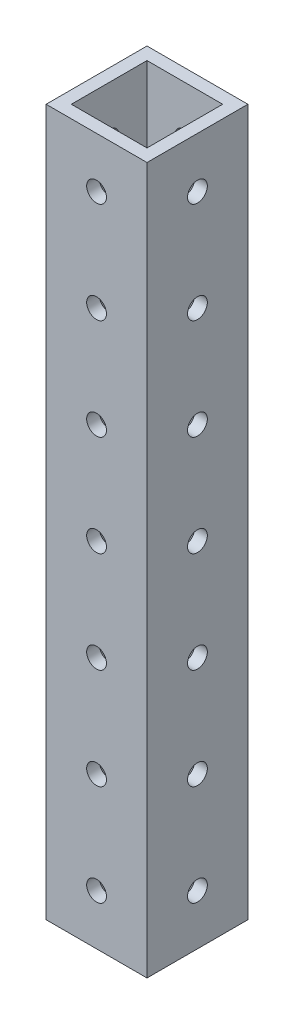
ISO-10303-21;
HEADER;
FILE_DESCRIPTION(('STEP AP214'),'2;1');
FILE_NAME('part.step','',(''),(''),'','','');
FILE_SCHEMA(('AUTOMOTIVE_DESIGN { 1 0 10303 214 1 1 1 1 }'));
ENDSEC;
DATA;
#1=APPLICATION_CONTEXT('core data for automotive mechanical design processes');
#2=APPLICATION_PROTOCOL_DEFINITION('international standard','automotive_design',2000,#1);
#3=PRODUCT_CONTEXT('',#1,'mechanical');
#4=PRODUCT('Part','Part','',(#3));
#5=PRODUCT_RELATED_PRODUCT_CATEGORY('part','',(#4));
#6=PRODUCT_DEFINITION_FORMATION('','',#4);
#7=PRODUCT_DEFINITION_CONTEXT('part definition',#1,'design');
#8=PRODUCT_DEFINITION('design','',#6,#7);
#9=PRODUCT_DEFINITION_SHAPE('','',#8);
#10=(LENGTH_UNIT() NAMED_UNIT(*) SI_UNIT(.MILLI.,.METRE.));
#11=(NAMED_UNIT(*) PLANE_ANGLE_UNIT() SI_UNIT($,.RADIAN.));
#12=(NAMED_UNIT(*) SI_UNIT($,.STERADIAN.) SOLID_ANGLE_UNIT());
#13=UNCERTAINTY_MEASURE_WITH_UNIT(LENGTH_MEASURE(1.E-05),#10,'distance_accuracy_value','');
#14=(GEOMETRIC_REPRESENTATION_CONTEXT(3) GLOBAL_UNCERTAINTY_ASSIGNED_CONTEXT((#13)) GLOBAL_UNIT_ASSIGNED_CONTEXT((#10,
#11,#12)) REPRESENTATION_CONTEXT('',''));
#15=CARTESIAN_POINT('',(0.,0.,0.));
#16=DIRECTION('',(0.,0.,1.));
#17=DIRECTION('',(1.,0.,0.));
#18=AXIS2_PLACEMENT_3D('',#15,#16,#17);
#19=CARTESIAN_POINT('',(6.35000000000008,678.023468227804,-25.4));
#20=DIRECTION('',(0.,1.,0.));
#21=DIRECTION('',(0.,0.,1.));
#22=AXIS2_PLACEMENT_3D('',#19,#20,#21);
#23=PLANE('',#22);
#24=DIRECTION('',(-1.,0.,0.));
#25=VECTOR('',#24,1.);
#26=CARTESIAN_POINT('',(6.35000000000008,678.023468227804,0.));
#27=LINE('',#26,#25);
#28=CARTESIAN_POINT('',(31.7500000000001,678.023468227804,0.));
#29=VERTEX_POINT('',#28);
#30=CARTESIAN_POINT('',(6.35000000000008,678.023468227804,0.));
#31=VERTEX_POINT('',#30);
#32=EDGE_CURVE('E145',#29,#31,#27,.T.);
#33=ORIENTED_EDGE('',*,*,#32,.F.);
#34=DIRECTION('',(0.,0.,1.));
#35=VECTOR('',#34,1.);
#36=CARTESIAN_POINT('',(31.7500000000001,678.023468227804,-25.4));
#37=LINE('',#36,#35);
#38=CARTESIAN_POINT('',(31.7500000000001,678.023468227804,-25.4));
#39=VERTEX_POINT('',#38);
#40=EDGE_CURVE('E48',#39,#29,#37,.T.);
#41=ORIENTED_EDGE('',*,*,#40,.F.);
#42=DIRECTION('',(-1.,0.,0.));
#43=VECTOR('',#42,1.);
#44=CARTESIAN_POINT('',(6.35000000000008,678.023468227804,-25.4));
#45=LINE('',#44,#43);
#46=CARTESIAN_POINT('',(6.35000000000008,678.023468227804,-25.4));
#47=VERTEX_POINT('',#46);
#48=EDGE_CURVE('E151',#39,#47,#45,.T.);
#49=ORIENTED_EDGE('',*,*,#48,.T.);
#50=DIRECTION('',(0.,0.,1.));
#51=VECTOR('',#50,1.);
#52=CARTESIAN_POINT('',(6.35000000000008,678.023468227804,-25.4));
#53=LINE('',#52,#51);
#54=EDGE_CURVE('E11',#47,#31,#53,.T.);
#55=ORIENTED_EDGE('',*,*,#54,.T.);
#56=EDGE_LOOP('',(#33,#41,#49,#55));
#57=FACE_BOUND('',#56,.T.);
#58=DIRECTION('',(0.,0.,1.));
#59=VECTOR('',#58,1.);
#60=CARTESIAN_POINT('',(28.5750000000001,678.023468227804,-25.4));
#61=LINE('',#60,#59);
#62=CARTESIAN_POINT('',(28.5750000000001,678.023468227804,-22.225));
#63=VERTEX_POINT('',#62);
#64=CARTESIAN_POINT('',(28.5750000000001,678.023468227804,-3.175));
#65=VERTEX_POINT('',#64);
#66=EDGE_CURVE('E115',#63,#65,#61,.T.);
#67=ORIENTED_EDGE('',*,*,#66,.T.);
#68=DIRECTION('',(-1.,0.,0.));
#69=VECTOR('',#68,1.);
#70=CARTESIAN_POINT('',(0.,678.023468227804,-3.175));
#71=LINE('',#70,#69);
#72=CARTESIAN_POINT('',(9.52500000000007,678.023468227804,-3.175));
#73=VERTEX_POINT('',#72);
#74=EDGE_CURVE('E121',#65,#73,#71,.T.);
#75=ORIENTED_EDGE('',*,*,#74,.T.);
#76=DIRECTION('',(0.,0.,1.));
#77=VECTOR('',#76,1.);
#78=CARTESIAN_POINT('',(9.52500000000007,678.023468227804,-25.4));
#79=LINE('',#78,#77);
#80=CARTESIAN_POINT('',(9.52500000000007,678.023468227804,-22.225));
#81=VERTEX_POINT('',#80);
#82=EDGE_CURVE('E106',#81,#73,#79,.T.);
#83=ORIENTED_EDGE('',*,*,#82,.F.);
#84=DIRECTION('',(-1.,0.,0.));
#85=VECTOR('',#84,1.);
#86=CARTESIAN_POINT('',(0.,678.023468227804,-22.225));
#87=LINE('',#86,#85);
#88=EDGE_CURVE('E56',#63,#81,#87,.T.);
#89=ORIENTED_EDGE('',*,*,#88,.F.);
#90=EDGE_LOOP('',(#67,#75,#83,#89));
#91=FACE_BOUND('',#90,.T.);
#92=ADVANCED_FACE('F39',(#57,#91),#23,.T.);
#93=CARTESIAN_POINT('',(6.3500000000001,500.223468227803,-25.4));
#94=DIRECTION('',(0.,-1.,0.));
#95=DIRECTION('',(0.,0.,-1.));
#96=AXIS2_PLACEMENT_3D('',#93,#94,#95);
#97=PLANE('',#96);
#98=DIRECTION('',(1.,0.,0.));
#99=VECTOR('',#98,1.);
#100=CARTESIAN_POINT('',(6.3500000000001,500.223468227803,0.));
#101=LINE('',#100,#99);
#102=CARTESIAN_POINT('',(6.3500000000001,500.223468227803,0.));
#103=VERTEX_POINT('',#102);
#104=CARTESIAN_POINT('',(31.7500000000001,500.223468227803,0.));
#105=VERTEX_POINT('',#104);
#106=EDGE_CURVE('E157',#103,#105,#101,.T.);
#107=ORIENTED_EDGE('',*,*,#106,.F.);
#108=DIRECTION('',(0.,0.,1.));
#109=VECTOR('',#108,1.);
#110=CARTESIAN_POINT('',(6.3500000000001,500.223468227803,-25.4));
#111=LINE('',#110,#109);
#112=CARTESIAN_POINT('',(6.3500000000001,500.223468227803,-25.4));
#113=VERTEX_POINT('',#112);
#114=EDGE_CURVE('E154',#113,#103,#111,.T.);
#115=ORIENTED_EDGE('',*,*,#114,.F.);
#116=DIRECTION('',(1.,0.,0.));
#117=VECTOR('',#116,1.);
#118=CARTESIAN_POINT('',(6.3500000000001,500.223468227803,-25.4));
#119=LINE('',#118,#117);
#120=CARTESIAN_POINT('',(31.7500000000001,500.223468227803,-25.4));
#121=VERTEX_POINT('',#120);
#122=EDGE_CURVE('E144',#113,#121,#119,.T.);
#123=ORIENTED_EDGE('',*,*,#122,.T.);
#124=DIRECTION('',(0.,0.,1.));
#125=VECTOR('',#124,1.);
#126=CARTESIAN_POINT('',(31.7500000000001,500.223468227803,-25.4));
#127=LINE('',#126,#125);
#128=EDGE_CURVE('E166',#121,#105,#127,.T.);
#129=ORIENTED_EDGE('',*,*,#128,.T.);
#130=EDGE_LOOP('',(#107,#115,#123,#129));
#131=FACE_BOUND('',#130,.T.);
#132=DIRECTION('',(0.,0.,1.));
#133=VECTOR('',#132,1.);
#134=CARTESIAN_POINT('',(9.5250000000001,500.223468227803,-25.4));
#135=LINE('',#134,#133);
#136=CARTESIAN_POINT('',(9.5250000000001,500.223468227803,-22.225));
#137=VERTEX_POINT('',#136);
#138=CARTESIAN_POINT('',(9.5250000000001,500.223468227803,-3.175));
#139=VERTEX_POINT('',#138);
#140=EDGE_CURVE('E135',#137,#139,#135,.T.);
#141=ORIENTED_EDGE('',*,*,#140,.T.);
#142=DIRECTION('',(1.,0.,0.));
#143=VECTOR('',#142,1.);
#144=CARTESIAN_POINT('',(0.,500.223468227803,-3.175));
#145=LINE('',#144,#143);
#146=CARTESIAN_POINT('',(28.5750000000001,500.223468227803,-3.175));
#147=VERTEX_POINT('',#146);
#148=EDGE_CURVE('E124',#139,#147,#145,.T.);
#149=ORIENTED_EDGE('',*,*,#148,.T.);
#150=DIRECTION('',(0.,0.,1.));
#151=VECTOR('',#150,1.);
#152=CARTESIAN_POINT('',(28.5750000000001,500.223468227803,-25.4));
#153=LINE('',#152,#151);
#154=CARTESIAN_POINT('',(28.5750000000001,500.223468227803,-22.225));
#155=VERTEX_POINT('',#154);
#156=EDGE_CURVE('E133',#155,#147,#153,.T.);
#157=ORIENTED_EDGE('',*,*,#156,.F.);
#158=DIRECTION('',(1.,0.,0.));
#159=VECTOR('',#158,1.);
#160=CARTESIAN_POINT('',(0.,500.223468227803,-22.225));
#161=LINE('',#160,#159);
#162=EDGE_CURVE('E61',#137,#155,#161,.T.);
#163=ORIENTED_EDGE('',*,*,#162,.F.);
#164=EDGE_LOOP('',(#141,#149,#157,#163));
#165=FACE_BOUND('',#164,.T.);
#166=ADVANCED_FACE('F294',(#131,#165),#97,.T.);
#167=CARTESIAN_POINT('',(6.35000000000008,678.023468227804,-25.4));
#168=DIRECTION('',(-1.,0.,0.));
#169=DIRECTION('',(0.,-1.,0.));
#170=AXIS2_PLACEMENT_3D('',#167,#168,#169);
#171=PLANE('',#170);
#172=CARTESIAN_POINT('',(6.3500000000001,512.923468227797,-12.6999999999756));
#173=DIRECTION('',(-1.,0.,0.));
#174=DIRECTION('',(0.,-1.,0.));
#175=AXIS2_PLACEMENT_3D('',#172,#173,#174);
#176=CIRCLE('',#175,2.48919999999991);
#177=CARTESIAN_POINT('',(6.3500000000001,510.434268227797,-12.6999999999756));
#178=VERTEX_POINT('',#177);
#179=EDGE_CURVE('E484',#178,#178,#176,.T.);
#180=ORIENTED_EDGE('',*,*,#179,.F.);
#181=EDGE_LOOP('',(#180));
#182=FACE_BOUND('',#181,.T.);
#183=CARTESIAN_POINT('',(6.35000000000009,538.323468227797,-12.6999999999756));
#184=DIRECTION('',(-1.,0.,0.));
#185=DIRECTION('',(0.,-1.,0.));
#186=AXIS2_PLACEMENT_3D('',#183,#184,#185);
#187=CIRCLE('',#186,2.48919999999991);
#188=CARTESIAN_POINT('',(6.35000000000009,535.834268227797,-12.6999999999756));
#189=VERTEX_POINT('',#188);
#190=EDGE_CURVE('E481',#189,#189,#187,.T.);
#191=ORIENTED_EDGE('',*,*,#190,.F.);
#192=EDGE_LOOP('',(#191));
#193=FACE_BOUND('',#192,.T.);
#194=CARTESIAN_POINT('',(6.35000000000009,563.723468227797,-12.6999999999756));
#195=DIRECTION('',(-1.,0.,0.));
#196=DIRECTION('',(0.,-1.,0.));
#197=AXIS2_PLACEMENT_3D('',#194,#195,#196);
#198=CIRCLE('',#197,2.48919999999991);
#199=CARTESIAN_POINT('',(6.35000000000009,561.234268227797,-12.6999999999756));
#200=VERTEX_POINT('',#199);
#201=EDGE_CURVE('E475',#200,#200,#198,.T.);
#202=ORIENTED_EDGE('',*,*,#201,.F.);
#203=EDGE_LOOP('',(#202));
#204=FACE_BOUND('',#203,.T.);
#205=CARTESIAN_POINT('',(6.35000000000009,589.123468227797,-12.6999999999756));
#206=DIRECTION('',(-1.,0.,0.));
#207=DIRECTION('',(0.,-1.,0.));
#208=AXIS2_PLACEMENT_3D('',#205,#206,#207);
#209=CIRCLE('',#208,2.48919999999988);
#210=CARTESIAN_POINT('',(6.35000000000009,586.634268227797,-12.6999999999756));
#211=VERTEX_POINT('',#210);
#212=EDGE_CURVE('E469',#211,#211,#209,.T.);
#213=ORIENTED_EDGE('',*,*,#212,.F.);
#214=EDGE_LOOP('',(#213));
#215=FACE_BOUND('',#214,.T.);
#216=CARTESIAN_POINT('',(6.35000000000008,614.523468227797,-12.6999999999756));
#217=DIRECTION('',(-1.,0.,0.));
#218=DIRECTION('',(0.,-1.,0.));
#219=AXIS2_PLACEMENT_3D('',#216,#217,#218);
#220=CIRCLE('',#219,2.48919999999991);
#221=CARTESIAN_POINT('',(6.35000000000008,612.034268227797,-12.6999999999756));
#222=VERTEX_POINT('',#221);
#223=EDGE_CURVE('E463',#222,#222,#220,.T.);
#224=ORIENTED_EDGE('',*,*,#223,.F.);
#225=EDGE_LOOP('',(#224));
#226=FACE_BOUND('',#225,.T.);
#227=CARTESIAN_POINT('',(6.35000000000008,639.923468227797,-12.6999999999756));
#228=DIRECTION('',(-1.,0.,0.));
#229=DIRECTION('',(0.,-1.,0.));
#230=AXIS2_PLACEMENT_3D('',#227,#228,#229);
#231=CIRCLE('',#230,2.48919999999991);
#232=CARTESIAN_POINT('',(6.35000000000008,637.434268227797,-12.6999999999756));
#233=VERTEX_POINT('',#232);
#234=EDGE_CURVE('E457',#233,#233,#231,.T.);
#235=ORIENTED_EDGE('',*,*,#234,.F.);
#236=EDGE_LOOP('',(#235));
#237=FACE_BOUND('',#236,.T.);
#238=CARTESIAN_POINT('',(6.35000000000008,665.323468227797,-12.6999999999756));
#239=DIRECTION('',(-1.,0.,0.));
#240=DIRECTION('',(0.,-1.,0.));
#241=AXIS2_PLACEMENT_3D('',#238,#239,#240);
#242=CIRCLE('',#241,2.48919999999989);
#243=CARTESIAN_POINT('',(6.35000000000008,662.834268227797,-12.6999999999756));
#244=VERTEX_POINT('',#243);
#245=EDGE_CURVE('E435',#244,#244,#242,.T.);
#246=ORIENTED_EDGE('',*,*,#245,.F.);
#247=EDGE_LOOP('',(#246));
#248=FACE_BOUND('',#247,.T.);
#249=DIRECTION('',(0.,-1.,0.));
#250=VECTOR('',#249,1.);
#251=CARTESIAN_POINT('',(6.35000000000008,678.023468227804,0.));
#252=LINE('',#251,#250);
#253=EDGE_CURVE('E114',#31,#103,#252,.T.);
#254=ORIENTED_EDGE('',*,*,#253,.F.);
#255=ORIENTED_EDGE('',*,*,#54,.F.);
#256=DIRECTION('',(0.,-1.,0.));
#257=VECTOR('',#256,1.);
#258=CARTESIAN_POINT('',(6.35000000000008,678.023468227804,-25.4));
#259=LINE('',#258,#257);
#260=EDGE_CURVE('E141',#47,#113,#259,.T.);
#261=ORIENTED_EDGE('',*,*,#260,.T.);
#262=ORIENTED_EDGE('',*,*,#114,.T.);
#263=EDGE_LOOP('',(#254,#255,#261,#262));
#264=FACE_BOUND('',#263,.T.);
#265=ADVANCED_FACE('F41',(#182,#193,#204,#215,#226,#237,#248,#264),#171,.T.);
#266=CARTESIAN_POINT('',(31.7500000000001,678.023468227804,-25.4));
#267=DIRECTION('',(1.,0.,0.));
#268=DIRECTION('',(0.,1.,0.));
#269=AXIS2_PLACEMENT_3D('',#266,#267,#268);
#270=PLANE('',#269);
#271=CARTESIAN_POINT('',(31.7500000000001,512.923468227797,-12.6999999999756));
#272=DIRECTION('',(-1.,0.,0.));
#273=DIRECTION('',(0.,-1.,0.));
#274=AXIS2_PLACEMENT_3D('',#271,#272,#273);
#275=CIRCLE('',#274,2.48919999999991);
#276=CARTESIAN_POINT('',(31.7500000000001,510.434268227797,-12.6999999999756));
#277=VERTEX_POINT('',#276);
#278=EDGE_CURVE('E201',#277,#277,#275,.T.);
#279=ORIENTED_EDGE('',*,*,#278,.T.);
#280=EDGE_LOOP('',(#279));
#281=FACE_BOUND('',#280,.T.);
#282=CARTESIAN_POINT('',(31.7500000000001,538.323468227797,-12.6999999999756));
#283=DIRECTION('',(-1.,0.,0.));
#284=DIRECTION('',(0.,-1.,0.));
#285=AXIS2_PLACEMENT_3D('',#282,#283,#284);
#286=CIRCLE('',#285,2.48919999999991);
#287=CARTESIAN_POINT('',(31.7500000000001,535.834268227797,-12.6999999999756));
#288=VERTEX_POINT('',#287);
#289=EDGE_CURVE('E478',#288,#288,#286,.T.);
#290=ORIENTED_EDGE('',*,*,#289,.T.);
#291=EDGE_LOOP('',(#290));
#292=FACE_BOUND('',#291,.T.);
#293=CARTESIAN_POINT('',(31.7500000000001,563.723468227797,-12.6999999999756));
#294=DIRECTION('',(-1.,0.,0.));
#295=DIRECTION('',(0.,-1.,0.));
#296=AXIS2_PLACEMENT_3D('',#293,#294,#295);
#297=CIRCLE('',#296,2.48919999999991);
#298=CARTESIAN_POINT('',(31.7500000000001,561.234268227797,-12.6999999999756));
#299=VERTEX_POINT('',#298);
#300=EDGE_CURVE('E472',#299,#299,#297,.T.);
#301=ORIENTED_EDGE('',*,*,#300,.T.);
#302=EDGE_LOOP('',(#301));
#303=FACE_BOUND('',#302,.T.);
#304=CARTESIAN_POINT('',(31.7500000000001,589.123468227797,-12.6999999999756));
#305=DIRECTION('',(-1.,0.,0.));
#306=DIRECTION('',(0.,-1.,0.));
#307=AXIS2_PLACEMENT_3D('',#304,#305,#306);
#308=CIRCLE('',#307,2.48919999999988);
#309=CARTESIAN_POINT('',(31.7500000000001,586.634268227797,-12.6999999999756));
#310=VERTEX_POINT('',#309);
#311=EDGE_CURVE('E466',#310,#310,#308,.T.);
#312=ORIENTED_EDGE('',*,*,#311,.T.);
#313=EDGE_LOOP('',(#312));
#314=FACE_BOUND('',#313,.T.);
#315=CARTESIAN_POINT('',(31.7500000000001,614.523468227797,-12.6999999999756));
#316=DIRECTION('',(-1.,0.,0.));
#317=DIRECTION('',(0.,-1.,0.));
#318=AXIS2_PLACEMENT_3D('',#315,#316,#317);
#319=CIRCLE('',#318,2.48919999999991);
#320=CARTESIAN_POINT('',(31.7500000000001,612.034268227797,-12.6999999999756));
#321=VERTEX_POINT('',#320);
#322=EDGE_CURVE('E460',#321,#321,#319,.T.);
#323=ORIENTED_EDGE('',*,*,#322,.T.);
#324=EDGE_LOOP('',(#323));
#325=FACE_BOUND('',#324,.T.);
#326=CARTESIAN_POINT('',(31.7500000000001,639.923468227797,-12.6999999999756));
#327=DIRECTION('',(-1.,0.,0.));
#328=DIRECTION('',(0.,-1.,0.));
#329=AXIS2_PLACEMENT_3D('',#326,#327,#328);
#330=CIRCLE('',#329,2.48919999999991);
#331=CARTESIAN_POINT('',(31.7500000000001,637.434268227797,-12.6999999999756));
#332=VERTEX_POINT('',#331);
#333=EDGE_CURVE('E438',#332,#332,#330,.T.);
#334=ORIENTED_EDGE('',*,*,#333,.T.);
#335=EDGE_LOOP('',(#334));
#336=FACE_BOUND('',#335,.T.);
#337=CARTESIAN_POINT('',(31.7500000000001,665.323468227797,-12.6999999999756));
#338=DIRECTION('',(-1.,0.,0.));
#339=DIRECTION('',(0.,-1.,0.));
#340=AXIS2_PLACEMENT_3D('',#337,#338,#339);
#341=CIRCLE('',#340,2.48919999999989);
#342=CARTESIAN_POINT('',(31.7500000000001,662.834268227797,-12.6999999999756));
#343=VERTEX_POINT('',#342);
#344=EDGE_CURVE('E433',#343,#343,#341,.T.);
#345=ORIENTED_EDGE('',*,*,#344,.T.);
#346=EDGE_LOOP('',(#345));
#347=FACE_BOUND('',#346,.T.);
#348=DIRECTION('',(0.,1.,0.));
#349=VECTOR('',#348,1.);
#350=CARTESIAN_POINT('',(31.7500000000001,678.023468227804,0.));
#351=LINE('',#350,#349);
#352=EDGE_CURVE('E160',#105,#29,#351,.T.);
#353=ORIENTED_EDGE('',*,*,#352,.F.);
#354=ORIENTED_EDGE('',*,*,#128,.F.);
#355=DIRECTION('',(0.,1.,0.));
#356=VECTOR('',#355,1.);
#357=CARTESIAN_POINT('',(31.7500000000001,678.023468227804,-25.4));
#358=LINE('',#357,#356);
#359=EDGE_CURVE('E148',#121,#39,#358,.T.);
#360=ORIENTED_EDGE('',*,*,#359,.T.);
#361=ORIENTED_EDGE('',*,*,#40,.T.);
#362=EDGE_LOOP('',(#353,#354,#360,#361));
#363=FACE_BOUND('',#362,.T.);
#364=ADVANCED_FACE('F302',(#281,#292,#303,#314,#325,#336,#347,#363),#270,.T.);
#365=CARTESIAN_POINT('',(0.,0.,-25.4));
#366=DIRECTION('',(0.,0.,1.));
#367=DIRECTION('',(1.,0.,0.));
#368=AXIS2_PLACEMENT_3D('',#365,#366,#367);
#369=PLANE('',#368);
#370=CARTESIAN_POINT('',(19.0500000000001,512.923468227804,-25.4));
#371=DIRECTION('',(0.,0.,1.));
#372=DIRECTION('',(1.,0.,0.));
#373=AXIS2_PLACEMENT_3D('',#370,#371,#372);
#374=CIRCLE('',#373,2.48919999999991);
#375=CARTESIAN_POINT('',(21.5392,512.923468227804,-25.4));
#376=VERTEX_POINT('',#375);
#377=EDGE_CURVE('E173',#376,#376,#374,.T.);
#378=ORIENTED_EDGE('',*,*,#377,.T.);
#379=EDGE_LOOP('',(#378));
#380=FACE_BOUND('',#379,.T.);
#381=CARTESIAN_POINT('',(19.0500000000001,538.323468227804,-25.4));
#382=DIRECTION('',(0.,0.,1.));
#383=DIRECTION('',(1.,0.,0.));
#384=AXIS2_PLACEMENT_3D('',#381,#382,#383);
#385=CIRCLE('',#384,2.48919999999991);
#386=CARTESIAN_POINT('',(21.5392,538.323468227804,-25.4));
#387=VERTEX_POINT('',#386);
#388=EDGE_CURVE('E243',#387,#387,#385,.T.);
#389=ORIENTED_EDGE('',*,*,#388,.T.);
#390=EDGE_LOOP('',(#389));
#391=FACE_BOUND('',#390,.T.);
#392=CARTESIAN_POINT('',(19.05,563.723468227804,-25.4));
#393=DIRECTION('',(0.,0.,1.));
#394=DIRECTION('',(1.,0.,0.));
#395=AXIS2_PLACEMENT_3D('',#392,#393,#394);
#396=CIRCLE('',#395,2.48919999999991);
#397=CARTESIAN_POINT('',(21.5391999999999,563.723468227804,-25.4));
#398=VERTEX_POINT('',#397);
#399=EDGE_CURVE('E249',#398,#398,#396,.T.);
#400=ORIENTED_EDGE('',*,*,#399,.T.);
#401=EDGE_LOOP('',(#400));
#402=FACE_BOUND('',#401,.T.);
#403=CARTESIAN_POINT('',(19.05,589.123468227804,-25.4));
#404=DIRECTION('',(0.,0.,1.));
#405=DIRECTION('',(1.,0.,0.));
#406=AXIS2_PLACEMENT_3D('',#403,#404,#405);
#407=CIRCLE('',#406,2.48919999999988);
#408=CARTESIAN_POINT('',(21.5391999999999,589.123468227804,-25.4));
#409=VERTEX_POINT('',#408);
#410=EDGE_CURVE('E255',#409,#409,#407,.T.);
#411=ORIENTED_EDGE('',*,*,#410,.T.);
#412=EDGE_LOOP('',(#411));
#413=FACE_BOUND('',#412,.T.);
#414=CARTESIAN_POINT('',(19.05,614.523468227804,-25.4));
#415=DIRECTION('',(0.,0.,1.));
#416=DIRECTION('',(1.,0.,0.));
#417=AXIS2_PLACEMENT_3D('',#414,#415,#416);
#418=CIRCLE('',#417,2.48919999999991);
#419=CARTESIAN_POINT('',(21.5391999999999,614.523468227804,-25.4));
#420=VERTEX_POINT('',#419);
#421=EDGE_CURVE('E261',#420,#420,#418,.T.);
#422=ORIENTED_EDGE('',*,*,#421,.T.);
#423=EDGE_LOOP('',(#422));
#424=FACE_BOUND('',#423,.T.);
#425=CARTESIAN_POINT('',(19.0499999999999,639.923468227803,-25.4));
#426=DIRECTION('',(0.,0.,1.));
#427=DIRECTION('',(1.,0.,0.));
#428=AXIS2_PLACEMENT_3D('',#425,#426,#427);
#429=CIRCLE('',#428,2.48919999999991);
#430=CARTESIAN_POINT('',(21.5391999999999,639.923468227803,-25.4));
#431=VERTEX_POINT('',#430);
#432=EDGE_CURVE('E267',#431,#431,#429,.T.);
#433=ORIENTED_EDGE('',*,*,#432,.T.);
#434=EDGE_LOOP('',(#433));
#435=FACE_BOUND('',#434,.T.);
#436=CARTESIAN_POINT('',(19.0499999999999,665.323468227803,-25.4));
#437=DIRECTION('',(0.,0.,1.));
#438=DIRECTION('',(1.,0.,0.));
#439=AXIS2_PLACEMENT_3D('',#436,#437,#438);
#440=CIRCLE('',#439,2.48919999999993);
#441=CARTESIAN_POINT('',(21.5391999999999,665.323468227803,-25.4));
#442=VERTEX_POINT('',#441);
#443=EDGE_CURVE('E234',#442,#442,#440,.T.);
#444=ORIENTED_EDGE('',*,*,#443,.T.);
#445=EDGE_LOOP('',(#444));
#446=FACE_BOUND('',#445,.T.);
#447=ORIENTED_EDGE('',*,*,#260,.F.);
#448=ORIENTED_EDGE('',*,*,#48,.F.);
#449=ORIENTED_EDGE('',*,*,#359,.F.);
#450=ORIENTED_EDGE('',*,*,#122,.F.);
#451=EDGE_LOOP('',(#447,#448,#449,#450));
#452=FACE_BOUND('',#451,.T.);
#453=ADVANCED_FACE('F309',(#380,#391,#402,#413,#424,#435,#446,#452),#369,.F.);
#454=CARTESIAN_POINT('',(0.,0.,0.));
#455=DIRECTION('',(0.,0.,1.));
#456=DIRECTION('',(1.,0.,0.));
#457=AXIS2_PLACEMENT_3D('',#454,#455,#456);
#458=PLANE('',#457);
#459=CARTESIAN_POINT('',(19.0500000000001,512.923468227804,0.));
#460=DIRECTION('',(0.,0.,1.));
#461=DIRECTION('',(1.,0.,0.));
#462=AXIS2_PLACEMENT_3D('',#459,#460,#461);
#463=CIRCLE('',#462,2.48919999999991);
#464=CARTESIAN_POINT('',(21.5392,512.923468227804,0.));
#465=VERTEX_POINT('',#464);
#466=EDGE_CURVE('E237',#465,#465,#463,.T.);
#467=ORIENTED_EDGE('',*,*,#466,.F.);
#468=EDGE_LOOP('',(#467));
#469=FACE_BOUND('',#468,.T.);
#470=CARTESIAN_POINT('',(19.0500000000001,538.323468227804,0.));
#471=DIRECTION('',(0.,0.,1.));
#472=DIRECTION('',(1.,0.,0.));
#473=AXIS2_PLACEMENT_3D('',#470,#471,#472);
#474=CIRCLE('',#473,2.48919999999991);
#475=CARTESIAN_POINT('',(21.5392,538.323468227804,0.));
#476=VERTEX_POINT('',#475);
#477=EDGE_CURVE('E240',#476,#476,#474,.T.);
#478=ORIENTED_EDGE('',*,*,#477,.F.);
#479=EDGE_LOOP('',(#478));
#480=FACE_BOUND('',#479,.T.);
#481=CARTESIAN_POINT('',(19.05,563.723468227804,0.));
#482=DIRECTION('',(0.,0.,1.));
#483=DIRECTION('',(1.,0.,0.));
#484=AXIS2_PLACEMENT_3D('',#481,#482,#483);
#485=CIRCLE('',#484,2.48919999999991);
#486=CARTESIAN_POINT('',(21.5391999999999,563.723468227804,0.));
#487=VERTEX_POINT('',#486);
#488=EDGE_CURVE('E246',#487,#487,#485,.T.);
#489=ORIENTED_EDGE('',*,*,#488,.F.);
#490=EDGE_LOOP('',(#489));
#491=FACE_BOUND('',#490,.T.);
#492=CARTESIAN_POINT('',(19.05,589.123468227804,0.));
#493=DIRECTION('',(0.,0.,1.));
#494=DIRECTION('',(1.,0.,0.));
#495=AXIS2_PLACEMENT_3D('',#492,#493,#494);
#496=CIRCLE('',#495,2.48919999999988);
#497=CARTESIAN_POINT('',(21.5391999999999,589.123468227804,0.));
#498=VERTEX_POINT('',#497);
#499=EDGE_CURVE('E252',#498,#498,#496,.T.);
#500=ORIENTED_EDGE('',*,*,#499,.F.);
#501=EDGE_LOOP('',(#500));
#502=FACE_BOUND('',#501,.T.);
#503=CARTESIAN_POINT('',(19.05,614.523468227804,0.));
#504=DIRECTION('',(0.,0.,1.));
#505=DIRECTION('',(1.,0.,0.));
#506=AXIS2_PLACEMENT_3D('',#503,#504,#505);
#507=CIRCLE('',#506,2.48919999999991);
#508=CARTESIAN_POINT('',(21.5391999999999,614.523468227804,0.));
#509=VERTEX_POINT('',#508);
#510=EDGE_CURVE('E258',#509,#509,#507,.T.);
#511=ORIENTED_EDGE('',*,*,#510,.F.);
#512=EDGE_LOOP('',(#511));
#513=FACE_BOUND('',#512,.T.);
#514=CARTESIAN_POINT('',(19.0499999999999,639.923468227803,0.));
#515=DIRECTION('',(0.,0.,1.));
#516=DIRECTION('',(1.,0.,0.));
#517=AXIS2_PLACEMENT_3D('',#514,#515,#516);
#518=CIRCLE('',#517,2.48919999999991);
#519=CARTESIAN_POINT('',(21.5391999999999,639.923468227803,0.));
#520=VERTEX_POINT('',#519);
#521=EDGE_CURVE('E264',#520,#520,#518,.T.);
#522=ORIENTED_EDGE('',*,*,#521,.F.);
#523=EDGE_LOOP('',(#522));
#524=FACE_BOUND('',#523,.T.);
#525=CARTESIAN_POINT('',(19.0499999999999,665.323468227803,0.));
#526=DIRECTION('',(0.,0.,1.));
#527=DIRECTION('',(1.,0.,0.));
#528=AXIS2_PLACEMENT_3D('',#525,#526,#527);
#529=CIRCLE('',#528,2.48919999999993);
#530=CARTESIAN_POINT('',(21.5391999999999,665.323468227803,0.));
#531=VERTEX_POINT('',#530);
#532=EDGE_CURVE('E270',#531,#531,#529,.T.);
#533=ORIENTED_EDGE('',*,*,#532,.F.);
#534=EDGE_LOOP('',(#533));
#535=FACE_BOUND('',#534,.T.);
#536=ORIENTED_EDGE('',*,*,#253,.T.);
#537=ORIENTED_EDGE('',*,*,#106,.T.);
#538=ORIENTED_EDGE('',*,*,#352,.T.);
#539=ORIENTED_EDGE('',*,*,#32,.T.);
#540=EDGE_LOOP('',(#536,#537,#538,#539));
#541=FACE_BOUND('',#540,.T.);
#542=ADVANCED_FACE('F312',(#469,#480,#491,#502,#513,#524,#535,#541),#458,.T.);
#543=CARTESIAN_POINT('',(9.52500000000007,678.023468227804,-25.4));
#544=DIRECTION('',(-1.,0.,0.));
#545=DIRECTION('',(0.,-1.,0.));
#546=AXIS2_PLACEMENT_3D('',#543,#544,#545);
#547=PLANE('',#546);
#548=CARTESIAN_POINT('',(9.5250000000001,512.923468227797,-12.6999999999756));
#549=DIRECTION('',(-1.,0.,0.));
#550=DIRECTION('',(0.,-1.,0.));
#551=AXIS2_PLACEMENT_3D('',#548,#549,#550);
#552=CIRCLE('',#551,2.48919999999991);
#553=CARTESIAN_POINT('',(9.5250000000001,510.434268227797,-12.6999999999756));
#554=VERTEX_POINT('',#553);
#555=EDGE_CURVE('E231',#554,#554,#552,.T.);
#556=ORIENTED_EDGE('',*,*,#555,.T.);
#557=EDGE_LOOP('',(#556));
#558=FACE_BOUND('',#557,.T.);
#559=CARTESIAN_POINT('',(9.52500000000009,538.323468227797,-12.6999999999756));
#560=DIRECTION('',(-1.,0.,0.));
#561=DIRECTION('',(0.,-1.,0.));
#562=AXIS2_PLACEMENT_3D('',#559,#560,#561);
#563=CIRCLE('',#562,2.48919999999991);
#564=CARTESIAN_POINT('',(9.52500000000009,535.834268227797,-12.6999999999756));
#565=VERTEX_POINT('',#564);
#566=EDGE_CURVE('E219',#565,#565,#563,.T.);
#567=ORIENTED_EDGE('',*,*,#566,.T.);
#568=EDGE_LOOP('',(#567));
#569=FACE_BOUND('',#568,.T.);
#570=CARTESIAN_POINT('',(9.52500000000009,563.723468227797,-12.6999999999756));
#571=DIRECTION('',(-1.,0.,0.));
#572=DIRECTION('',(0.,-1.,0.));
#573=AXIS2_PLACEMENT_3D('',#570,#571,#572);
#574=CIRCLE('',#573,2.48919999999991);
#575=CARTESIAN_POINT('',(9.52500000000009,561.234268227797,-12.6999999999756));
#576=VERTEX_POINT('',#575);
#577=EDGE_CURVE('E216',#576,#576,#574,.T.);
#578=ORIENTED_EDGE('',*,*,#577,.T.);
#579=EDGE_LOOP('',(#578));
#580=FACE_BOUND('',#579,.T.);
#581=CARTESIAN_POINT('',(9.52500000000009,589.123468227797,-12.6999999999756));
#582=DIRECTION('',(-1.,0.,0.));
#583=DIRECTION('',(0.,-1.,0.));
#584=AXIS2_PLACEMENT_3D('',#581,#582,#583);
#585=CIRCLE('',#584,2.48919999999988);
#586=CARTESIAN_POINT('',(9.52500000000009,586.634268227797,-12.6999999999756));
#587=VERTEX_POINT('',#586);
#588=EDGE_CURVE('E213',#587,#587,#585,.T.);
#589=ORIENTED_EDGE('',*,*,#588,.T.);
#590=EDGE_LOOP('',(#589));
#591=FACE_BOUND('',#590,.T.);
#592=CARTESIAN_POINT('',(9.52500000000008,614.523468227797,-12.6999999999756));
#593=DIRECTION('',(-1.,0.,0.));
#594=DIRECTION('',(0.,-1.,0.));
#595=AXIS2_PLACEMENT_3D('',#592,#593,#594);
#596=CIRCLE('',#595,2.48919999999991);
#597=CARTESIAN_POINT('',(9.52500000000008,612.034268227797,-12.6999999999756));
#598=VERTEX_POINT('',#597);
#599=EDGE_CURVE('E209',#598,#598,#596,.T.);
#600=ORIENTED_EDGE('',*,*,#599,.T.);
#601=EDGE_LOOP('',(#600));
#602=FACE_BOUND('',#601,.T.);
#603=CARTESIAN_POINT('',(9.52500000000008,639.923468227797,-12.6999999999756));
#604=DIRECTION('',(-1.,0.,0.));
#605=DIRECTION('',(0.,-1.,0.));
#606=AXIS2_PLACEMENT_3D('',#603,#604,#605);
#607=CIRCLE('',#606,2.48919999999991);
#608=CARTESIAN_POINT('',(9.52500000000008,637.434268227797,-12.6999999999756));
#609=VERTEX_POINT('',#608);
#610=EDGE_CURVE('E205',#609,#609,#607,.T.);
#611=ORIENTED_EDGE('',*,*,#610,.T.);
#612=EDGE_LOOP('',(#611));
#613=FACE_BOUND('',#612,.T.);
#614=CARTESIAN_POINT('',(9.52500000000007,665.323468227797,-12.6999999999756));
#615=DIRECTION('',(-1.,0.,0.));
#616=DIRECTION('',(0.,-1.,0.));
#617=AXIS2_PLACEMENT_3D('',#614,#615,#616);
#618=CIRCLE('',#617,2.48919999999989);
#619=CARTESIAN_POINT('',(9.52500000000007,662.834268227797,-12.6999999999756));
#620=VERTEX_POINT('',#619);
#621=EDGE_CURVE('E200',#620,#620,#618,.T.);
#622=ORIENTED_EDGE('',*,*,#621,.T.);
#623=EDGE_LOOP('',(#622));
#624=FACE_BOUND('',#623,.T.);
#625=DIRECTION('',(0.,-1.,0.));
#626=VECTOR('',#625,1.);
#627=CARTESIAN_POINT('',(9.52500000000016,0.,-3.175));
#628=LINE('',#627,#626);
#629=EDGE_CURVE('E109',#73,#139,#628,.T.);
#630=ORIENTED_EDGE('',*,*,#629,.T.);
#631=ORIENTED_EDGE('',*,*,#140,.F.);
#632=DIRECTION('',(0.,-1.,0.));
#633=VECTOR('',#632,1.);
#634=CARTESIAN_POINT('',(9.52500000000016,0.,-22.225));
#635=LINE('',#634,#633);
#636=EDGE_CURVE('E111',#81,#137,#635,.T.);
#637=ORIENTED_EDGE('',*,*,#636,.F.);
#638=ORIENTED_EDGE('',*,*,#82,.T.);
#639=EDGE_LOOP('',(#630,#631,#637,#638));
#640=FACE_BOUND('',#639,.T.);
#641=ADVANCED_FACE('F108',(#558,#569,#580,#591,#602,#613,#624,#640),#547,.F.);
#642=CARTESIAN_POINT('',(28.5750000000001,678.023468227804,-25.4));
#643=DIRECTION('',(1.,0.,0.));
#644=DIRECTION('',(0.,1.,0.));
#645=AXIS2_PLACEMENT_3D('',#642,#643,#644);
#646=PLANE('',#645);
#647=CARTESIAN_POINT('',(28.5750000000001,512.923468227797,-12.6999999999756));
#648=DIRECTION('',(1.,0.,0.));
#649=DIRECTION('',(0.,1.,0.));
#650=AXIS2_PLACEMENT_3D('',#647,#648,#649);
#651=CIRCLE('',#650,2.48919999999991);
#652=CARTESIAN_POINT('',(28.5750000000001,515.412668227797,-12.6999999999756));
#653=VERTEX_POINT('',#652);
#654=EDGE_CURVE('E43',#653,#653,#651,.T.);
#655=ORIENTED_EDGE('',*,*,#654,.T.);
#656=EDGE_LOOP('',(#655));
#657=FACE_BOUND('',#656,.T.);
#658=CARTESIAN_POINT('',(28.5750000000001,538.323468227797,-12.6999999999756));
#659=DIRECTION('',(1.,0.,0.));
#660=DIRECTION('',(0.,1.,0.));
#661=AXIS2_PLACEMENT_3D('',#658,#659,#660);
#662=CIRCLE('',#661,2.48919999999991);
#663=CARTESIAN_POINT('',(28.5750000000001,540.812668227797,-12.6999999999756));
#664=VERTEX_POINT('',#663);
#665=EDGE_CURVE('E217',#664,#664,#662,.T.);
#666=ORIENTED_EDGE('',*,*,#665,.T.);
#667=EDGE_LOOP('',(#666));
#668=FACE_BOUND('',#667,.T.);
#669=CARTESIAN_POINT('',(28.5750000000001,563.723468227797,-12.6999999999756));
#670=DIRECTION('',(1.,0.,0.));
#671=DIRECTION('',(0.,1.,0.));
#672=AXIS2_PLACEMENT_3D('',#669,#670,#671);
#673=CIRCLE('',#672,2.48919999999991);
#674=CARTESIAN_POINT('',(28.5750000000001,566.212668227797,-12.6999999999756));
#675=VERTEX_POINT('',#674);
#676=EDGE_CURVE('E214',#675,#675,#673,.T.);
#677=ORIENTED_EDGE('',*,*,#676,.T.);
#678=EDGE_LOOP('',(#677));
#679=FACE_BOUND('',#678,.T.);
#680=CARTESIAN_POINT('',(28.5750000000001,589.123468227797,-12.6999999999756));
#681=DIRECTION('',(1.,0.,0.));
#682=DIRECTION('',(0.,1.,0.));
#683=AXIS2_PLACEMENT_3D('',#680,#681,#682);
#684=CIRCLE('',#683,2.48919999999988);
#685=CARTESIAN_POINT('',(28.5750000000001,591.612668227797,-12.6999999999756));
#686=VERTEX_POINT('',#685);
#687=EDGE_CURVE('E210',#686,#686,#684,.T.);
#688=ORIENTED_EDGE('',*,*,#687,.T.);
#689=EDGE_LOOP('',(#688));
#690=FACE_BOUND('',#689,.T.);
#691=CARTESIAN_POINT('',(28.5750000000001,614.523468227797,-12.6999999999756));
#692=DIRECTION('',(1.,0.,0.));
#693=DIRECTION('',(0.,1.,0.));
#694=AXIS2_PLACEMENT_3D('',#691,#692,#693);
#695=CIRCLE('',#694,2.48919999999991);
#696=CARTESIAN_POINT('',(28.5750000000001,617.012668227797,-12.6999999999756));
#697=VERTEX_POINT('',#696);
#698=EDGE_CURVE('E206',#697,#697,#695,.T.);
#699=ORIENTED_EDGE('',*,*,#698,.T.);
#700=EDGE_LOOP('',(#699));
#701=FACE_BOUND('',#700,.T.);
#702=CARTESIAN_POINT('',(28.5750000000001,639.923468227797,-12.6999999999756));
#703=DIRECTION('',(1.,0.,0.));
#704=DIRECTION('',(0.,1.,0.));
#705=AXIS2_PLACEMENT_3D('',#702,#703,#704);
#706=CIRCLE('',#705,2.48919999999991);
#707=CARTESIAN_POINT('',(28.5750000000001,642.412668227797,-12.6999999999756));
#708=VERTEX_POINT('',#707);
#709=EDGE_CURVE('E202',#708,#708,#706,.T.);
#710=ORIENTED_EDGE('',*,*,#709,.T.);
#711=EDGE_LOOP('',(#710));
#712=FACE_BOUND('',#711,.T.);
#713=CARTESIAN_POINT('',(28.5750000000001,665.323468227797,-12.6999999999756));
#714=DIRECTION('',(1.,0.,0.));
#715=DIRECTION('',(0.,1.,0.));
#716=AXIS2_PLACEMENT_3D('',#713,#714,#715);
#717=CIRCLE('',#716,2.48919999999989);
#718=CARTESIAN_POINT('',(28.5750000000001,667.812668227797,-12.6999999999756));
#719=VERTEX_POINT('',#718);
#720=EDGE_CURVE('E197',#719,#719,#717,.T.);
#721=ORIENTED_EDGE('',*,*,#720,.T.);
#722=EDGE_LOOP('',(#721));
#723=FACE_BOUND('',#722,.T.);
#724=DIRECTION('',(0.,1.,0.));
#725=VECTOR('',#724,1.);
#726=CARTESIAN_POINT('',(28.5750000000002,0.,-3.175));
#727=LINE('',#726,#725);
#728=EDGE_CURVE('E127',#147,#65,#727,.T.);
#729=ORIENTED_EDGE('',*,*,#728,.T.);
#730=ORIENTED_EDGE('',*,*,#66,.F.);
#731=DIRECTION('',(0.,1.,0.));
#732=VECTOR('',#731,1.);
#733=CARTESIAN_POINT('',(28.5750000000002,0.,-22.225));
#734=LINE('',#733,#732);
#735=EDGE_CURVE('E136',#155,#63,#734,.T.);
#736=ORIENTED_EDGE('',*,*,#735,.F.);
#737=ORIENTED_EDGE('',*,*,#156,.T.);
#738=EDGE_LOOP('',(#729,#730,#736,#737));
#739=FACE_BOUND('',#738,.T.);
#740=ADVANCED_FACE('F292',(#657,#668,#679,#690,#701,#712,#723,#739),#646,.F.);
#741=CARTESIAN_POINT('',(0.,0.,-22.225));
#742=DIRECTION('',(0.,0.,1.));
#743=DIRECTION('',(1.,0.,0.));
#744=AXIS2_PLACEMENT_3D('',#741,#742,#743);
#745=PLANE('',#744);
#746=CARTESIAN_POINT('',(19.0500000000001,512.923468227804,-22.225));
#747=DIRECTION('',(0.,0.,1.));
#748=DIRECTION('',(1.,0.,0.));
#749=AXIS2_PLACEMENT_3D('',#746,#747,#748);
#750=CIRCLE('',#749,2.48919999999991);
#751=CARTESIAN_POINT('',(21.5392,512.923468227804,-22.225));
#752=VERTEX_POINT('',#751);
#753=EDGE_CURVE('E125',#752,#752,#750,.T.);
#754=ORIENTED_EDGE('',*,*,#753,.F.);
#755=EDGE_LOOP('',(#754));
#756=FACE_BOUND('',#755,.T.);
#757=CARTESIAN_POINT('',(19.0500000000001,538.323468227804,-22.225));
#758=DIRECTION('',(0.,0.,1.));
#759=DIRECTION('',(1.,0.,0.));
#760=AXIS2_PLACEMENT_3D('',#757,#758,#759);
#761=CIRCLE('',#760,2.48919999999991);
#762=CARTESIAN_POINT('',(21.5392,538.323468227804,-22.225));
#763=VERTEX_POINT('',#762);
#764=EDGE_CURVE('E193',#763,#763,#761,.T.);
#765=ORIENTED_EDGE('',*,*,#764,.F.);
#766=EDGE_LOOP('',(#765));
#767=FACE_BOUND('',#766,.T.);
#768=CARTESIAN_POINT('',(19.05,563.723468227804,-22.225));
#769=DIRECTION('',(0.,0.,1.));
#770=DIRECTION('',(1.,0.,0.));
#771=AXIS2_PLACEMENT_3D('',#768,#769,#770);
#772=CIRCLE('',#771,2.48919999999991);
#773=CARTESIAN_POINT('',(21.5391999999999,563.723468227804,-22.225));
#774=VERTEX_POINT('',#773);
#775=EDGE_CURVE('E189',#774,#774,#772,.T.);
#776=ORIENTED_EDGE('',*,*,#775,.F.);
#777=EDGE_LOOP('',(#776));
#778=FACE_BOUND('',#777,.T.);
#779=CARTESIAN_POINT('',(19.05,589.123468227804,-22.225));
#780=DIRECTION('',(0.,0.,1.));
#781=DIRECTION('',(1.,0.,0.));
#782=AXIS2_PLACEMENT_3D('',#779,#780,#781);
#783=CIRCLE('',#782,2.48919999999988);
#784=CARTESIAN_POINT('',(21.5391999999999,589.123468227804,-22.225));
#785=VERTEX_POINT('',#784);
#786=EDGE_CURVE('E185',#785,#785,#783,.T.);
#787=ORIENTED_EDGE('',*,*,#786,.F.);
#788=EDGE_LOOP('',(#787));
#789=FACE_BOUND('',#788,.T.);
#790=CARTESIAN_POINT('',(19.05,614.523468227804,-22.225));
#791=DIRECTION('',(0.,0.,1.));
#792=DIRECTION('',(1.,0.,0.));
#793=AXIS2_PLACEMENT_3D('',#790,#791,#792);
#794=CIRCLE('',#793,2.48919999999991);
#795=CARTESIAN_POINT('',(21.5391999999999,614.523468227804,-22.225));
#796=VERTEX_POINT('',#795);
#797=EDGE_CURVE('E181',#796,#796,#794,.T.);
#798=ORIENTED_EDGE('',*,*,#797,.F.);
#799=EDGE_LOOP('',(#798));
#800=FACE_BOUND('',#799,.T.);
#801=CARTESIAN_POINT('',(19.0499999999999,639.923468227803,-22.225));
#802=DIRECTION('',(0.,0.,1.));
#803=DIRECTION('',(1.,0.,0.));
#804=AXIS2_PLACEMENT_3D('',#801,#802,#803);
#805=CIRCLE('',#804,2.48919999999991);
#806=CARTESIAN_POINT('',(21.5391999999999,639.923468227803,-22.225));
#807=VERTEX_POINT('',#806);
#808=EDGE_CURVE('E177',#807,#807,#805,.T.);
#809=ORIENTED_EDGE('',*,*,#808,.F.);
#810=EDGE_LOOP('',(#809));
#811=FACE_BOUND('',#810,.T.);
#812=CARTESIAN_POINT('',(19.0499999999999,665.323468227803,-22.225));
#813=DIRECTION('',(0.,0.,1.));
#814=DIRECTION('',(1.,0.,0.));
#815=AXIS2_PLACEMENT_3D('',#812,#813,#814);
#816=CIRCLE('',#815,2.48919999999993);
#817=CARTESIAN_POINT('',(21.5391999999999,665.323468227803,-22.225));
#818=VERTEX_POINT('',#817);
#819=EDGE_CURVE('E172',#818,#818,#816,.T.);
#820=ORIENTED_EDGE('',*,*,#819,.F.);
#821=EDGE_LOOP('',(#820));
#822=FACE_BOUND('',#821,.T.);
#823=ORIENTED_EDGE('',*,*,#636,.T.);
#824=ORIENTED_EDGE('',*,*,#162,.T.);
#825=ORIENTED_EDGE('',*,*,#735,.T.);
#826=ORIENTED_EDGE('',*,*,#88,.T.);
#827=EDGE_LOOP('',(#823,#824,#825,#826));
#828=FACE_BOUND('',#827,.T.);
#829=ADVANCED_FACE('F289',(#756,#767,#778,#789,#800,#811,#822,#828),#745,.T.);
#830=CARTESIAN_POINT('',(0.,0.,-3.175));
#831=DIRECTION('',(0.,0.,1.));
#832=DIRECTION('',(1.,0.,0.));
#833=AXIS2_PLACEMENT_3D('',#830,#831,#832);
#834=PLANE('',#833);
#835=CARTESIAN_POINT('',(19.0500000000001,512.923468227804,-3.175));
#836=DIRECTION('',(0.,0.,1.));
#837=DIRECTION('',(1.,0.,0.));
#838=AXIS2_PLACEMENT_3D('',#835,#836,#837);
#839=CIRCLE('',#838,2.48919999999991);
#840=CARTESIAN_POINT('',(21.5392,512.923468227804,-3.175));
#841=VERTEX_POINT('',#840);
#842=EDGE_CURVE('E194',#841,#841,#839,.T.);
#843=ORIENTED_EDGE('',*,*,#842,.T.);
#844=EDGE_LOOP('',(#843));
#845=FACE_BOUND('',#844,.T.);
#846=CARTESIAN_POINT('',(19.0500000000001,538.323468227804,-3.175));
#847=DIRECTION('',(0.,0.,1.));
#848=DIRECTION('',(1.,0.,0.));
#849=AXIS2_PLACEMENT_3D('',#846,#847,#848);
#850=CIRCLE('',#849,2.48919999999991);
#851=CARTESIAN_POINT('',(21.5392,538.323468227804,-3.175));
#852=VERTEX_POINT('',#851);
#853=EDGE_CURVE('E190',#852,#852,#850,.T.);
#854=ORIENTED_EDGE('',*,*,#853,.T.);
#855=EDGE_LOOP('',(#854));
#856=FACE_BOUND('',#855,.T.);
#857=CARTESIAN_POINT('',(19.05,563.723468227804,-3.175));
#858=DIRECTION('',(0.,0.,1.));
#859=DIRECTION('',(1.,0.,0.));
#860=AXIS2_PLACEMENT_3D('',#857,#858,#859);
#861=CIRCLE('',#860,2.48919999999991);
#862=CARTESIAN_POINT('',(21.5391999999999,563.723468227804,-3.175));
#863=VERTEX_POINT('',#862);
#864=EDGE_CURVE('E186',#863,#863,#861,.T.);
#865=ORIENTED_EDGE('',*,*,#864,.T.);
#866=EDGE_LOOP('',(#865));
#867=FACE_BOUND('',#866,.T.);
#868=CARTESIAN_POINT('',(19.05,589.123468227804,-3.175));
#869=DIRECTION('',(0.,0.,1.));
#870=DIRECTION('',(1.,0.,0.));
#871=AXIS2_PLACEMENT_3D('',#868,#869,#870);
#872=CIRCLE('',#871,2.48919999999988);
#873=CARTESIAN_POINT('',(21.5391999999999,589.123468227804,-3.175));
#874=VERTEX_POINT('',#873);
#875=EDGE_CURVE('E182',#874,#874,#872,.T.);
#876=ORIENTED_EDGE('',*,*,#875,.T.);
#877=EDGE_LOOP('',(#876));
#878=FACE_BOUND('',#877,.T.);
#879=CARTESIAN_POINT('',(19.05,614.523468227804,-3.175));
#880=DIRECTION('',(0.,0.,1.));
#881=DIRECTION('',(1.,0.,0.));
#882=AXIS2_PLACEMENT_3D('',#879,#880,#881);
#883=CIRCLE('',#882,2.48919999999991);
#884=CARTESIAN_POINT('',(21.5391999999999,614.523468227804,-3.175));
#885=VERTEX_POINT('',#884);
#886=EDGE_CURVE('E178',#885,#885,#883,.T.);
#887=ORIENTED_EDGE('',*,*,#886,.T.);
#888=EDGE_LOOP('',(#887));
#889=FACE_BOUND('',#888,.T.);
#890=CARTESIAN_POINT('',(19.0499999999999,639.923468227803,-3.175));
#891=DIRECTION('',(0.,0.,1.));
#892=DIRECTION('',(1.,0.,0.));
#893=AXIS2_PLACEMENT_3D('',#890,#891,#892);
#894=CIRCLE('',#893,2.48919999999991);
#895=CARTESIAN_POINT('',(21.5391999999999,639.923468227803,-3.175));
#896=VERTEX_POINT('',#895);
#897=EDGE_CURVE('E174',#896,#896,#894,.T.);
#898=ORIENTED_EDGE('',*,*,#897,.T.);
#899=EDGE_LOOP('',(#898));
#900=FACE_BOUND('',#899,.T.);
#901=CARTESIAN_POINT('',(19.0499999999999,665.323468227803,-3.175));
#902=DIRECTION('',(0.,0.,1.));
#903=DIRECTION('',(1.,0.,0.));
#904=AXIS2_PLACEMENT_3D('',#901,#902,#903);
#905=CIRCLE('',#904,2.48919999999993);
#906=CARTESIAN_POINT('',(21.5391999999999,665.323468227803,-3.175));
#907=VERTEX_POINT('',#906);
#908=EDGE_CURVE('E169',#907,#907,#905,.T.);
#909=ORIENTED_EDGE('',*,*,#908,.T.);
#910=EDGE_LOOP('',(#909));
#911=FACE_BOUND('',#910,.T.);
#912=ORIENTED_EDGE('',*,*,#629,.F.);
#913=ORIENTED_EDGE('',*,*,#74,.F.);
#914=ORIENTED_EDGE('',*,*,#728,.F.);
#915=ORIENTED_EDGE('',*,*,#148,.F.);
#916=EDGE_LOOP('',(#912,#913,#914,#915));
#917=FACE_BOUND('',#916,.T.);
#918=ADVANCED_FACE('F119',(#845,#856,#867,#878,#889,#900,#911,#917),#834,.F.);
#919=CARTESIAN_POINT('',(19.0499999999999,665.323468227803,-25.4));
#920=DIRECTION('',(0.,0.,1.));
#921=DIRECTION('',(1.,0.,0.));
#922=AXIS2_PLACEMENT_3D('',#919,#920,#921);
#923=CYLINDRICAL_SURFACE('',#922,2.48919999999993);
#924=ORIENTED_EDGE('',*,*,#532,.T.);
#925=EDGE_LOOP('',(#924));
#926=FACE_BOUND('',#925,.T.);
#927=ORIENTED_EDGE('',*,*,#908,.F.);
#928=EDGE_LOOP('',(#927));
#929=FACE_BOUND('',#928,.T.);
#930=ADVANCED_FACE('F320',(#926,#929),#923,.F.);
#931=CARTESIAN_POINT('',(19.0499999999999,639.923468227803,-25.4));
#932=DIRECTION('',(0.,0.,1.));
#933=DIRECTION('',(1.,0.,0.));
#934=AXIS2_PLACEMENT_3D('',#931,#932,#933);
#935=CYLINDRICAL_SURFACE('',#934,2.48919999999991);
#936=ORIENTED_EDGE('',*,*,#521,.T.);
#937=EDGE_LOOP('',(#936));
#938=FACE_BOUND('',#937,.T.);
#939=ORIENTED_EDGE('',*,*,#897,.F.);
#940=EDGE_LOOP('',(#939));
#941=FACE_BOUND('',#940,.T.);
#942=ADVANCED_FACE('F341',(#938,#941),#935,.F.);
#943=CARTESIAN_POINT('',(19.05,614.523468227804,-25.4));
#944=DIRECTION('',(0.,0.,1.));
#945=DIRECTION('',(1.,0.,0.));
#946=AXIS2_PLACEMENT_3D('',#943,#944,#945);
#947=CYLINDRICAL_SURFACE('',#946,2.48919999999991);
#948=ORIENTED_EDGE('',*,*,#510,.T.);
#949=EDGE_LOOP('',(#948));
#950=FACE_BOUND('',#949,.T.);
#951=ORIENTED_EDGE('',*,*,#886,.F.);
#952=EDGE_LOOP('',(#951));
#953=FACE_BOUND('',#952,.T.);
#954=ADVANCED_FACE('F346',(#950,#953),#947,.F.);
#955=CARTESIAN_POINT('',(19.05,589.123468227804,-25.4));
#956=DIRECTION('',(0.,0.,1.));
#957=DIRECTION('',(1.,0.,0.));
#958=AXIS2_PLACEMENT_3D('',#955,#956,#957);
#959=CYLINDRICAL_SURFACE('',#958,2.48919999999988);
#960=ORIENTED_EDGE('',*,*,#499,.T.);
#961=EDGE_LOOP('',(#960));
#962=FACE_BOUND('',#961,.T.);
#963=ORIENTED_EDGE('',*,*,#875,.F.);
#964=EDGE_LOOP('',(#963));
#965=FACE_BOUND('',#964,.T.);
#966=ADVANCED_FACE('F351',(#962,#965),#959,.F.);
#967=CARTESIAN_POINT('',(19.05,563.723468227804,-25.4));
#968=DIRECTION('',(0.,0.,1.));
#969=DIRECTION('',(1.,0.,0.));
#970=AXIS2_PLACEMENT_3D('',#967,#968,#969);
#971=CYLINDRICAL_SURFACE('',#970,2.48919999999991);
#972=ORIENTED_EDGE('',*,*,#488,.T.);
#973=EDGE_LOOP('',(#972));
#974=FACE_BOUND('',#973,.T.);
#975=ORIENTED_EDGE('',*,*,#864,.F.);
#976=EDGE_LOOP('',(#975));
#977=FACE_BOUND('',#976,.T.);
#978=ADVANCED_FACE('F356',(#974,#977),#971,.F.);
#979=CARTESIAN_POINT('',(19.0500000000001,538.323468227804,-25.4));
#980=DIRECTION('',(0.,0.,1.));
#981=DIRECTION('',(1.,0.,0.));
#982=AXIS2_PLACEMENT_3D('',#979,#980,#981);
#983=CYLINDRICAL_SURFACE('',#982,2.48919999999991);
#984=ORIENTED_EDGE('',*,*,#477,.T.);
#985=EDGE_LOOP('',(#984));
#986=FACE_BOUND('',#985,.T.);
#987=ORIENTED_EDGE('',*,*,#853,.F.);
#988=EDGE_LOOP('',(#987));
#989=FACE_BOUND('',#988,.T.);
#990=ADVANCED_FACE('F361',(#986,#989),#983,.F.);
#991=CARTESIAN_POINT('',(19.0500000000001,512.923468227804,-25.4));
#992=DIRECTION('',(0.,0.,1.));
#993=DIRECTION('',(1.,0.,0.));
#994=AXIS2_PLACEMENT_3D('',#991,#992,#993);
#995=CYLINDRICAL_SURFACE('',#994,2.48919999999991);
#996=ORIENTED_EDGE('',*,*,#466,.T.);
#997=EDGE_LOOP('',(#996));
#998=FACE_BOUND('',#997,.T.);
#999=ORIENTED_EDGE('',*,*,#842,.F.);
#1000=EDGE_LOOP('',(#999));
#1001=FACE_BOUND('',#1000,.T.);
#1002=ADVANCED_FACE('F335',(#998,#1001),#995,.F.);
#1003=ORIENTED_EDGE('',*,*,#819,.T.);
#1004=EDGE_LOOP('',(#1003));
#1005=FACE_BOUND('',#1004,.T.);
#1006=ORIENTED_EDGE('',*,*,#443,.F.);
#1007=EDGE_LOOP('',(#1006));
#1008=FACE_BOUND('',#1007,.T.);
#1009=ADVANCED_FACE('F331',(#1005,#1008),#923,.F.);
#1010=ORIENTED_EDGE('',*,*,#808,.T.);
#1011=EDGE_LOOP('',(#1010));
#1012=FACE_BOUND('',#1011,.T.);
#1013=ORIENTED_EDGE('',*,*,#432,.F.);
#1014=EDGE_LOOP('',(#1013));
#1015=FACE_BOUND('',#1014,.T.);
#1016=ADVANCED_FACE('F334',(#1012,#1015),#935,.F.);
#1017=ORIENTED_EDGE('',*,*,#797,.T.);
#1018=EDGE_LOOP('',(#1017));
#1019=FACE_BOUND('',#1018,.T.);
#1020=ORIENTED_EDGE('',*,*,#421,.F.);
#1021=EDGE_LOOP('',(#1020));
#1022=FACE_BOUND('',#1021,.T.);
#1023=ADVANCED_FACE('F339',(#1019,#1022),#947,.F.);
#1024=ORIENTED_EDGE('',*,*,#786,.T.);
#1025=EDGE_LOOP('',(#1024));
#1026=FACE_BOUND('',#1025,.T.);
#1027=ORIENTED_EDGE('',*,*,#410,.F.);
#1028=EDGE_LOOP('',(#1027));
#1029=FACE_BOUND('',#1028,.T.);
#1030=ADVANCED_FACE('F344',(#1026,#1029),#959,.F.);
#1031=ORIENTED_EDGE('',*,*,#775,.T.);
#1032=EDGE_LOOP('',(#1031));
#1033=FACE_BOUND('',#1032,.T.);
#1034=ORIENTED_EDGE('',*,*,#399,.F.);
#1035=EDGE_LOOP('',(#1034));
#1036=FACE_BOUND('',#1035,.T.);
#1037=ADVANCED_FACE('F349',(#1033,#1036),#971,.F.);
#1038=ORIENTED_EDGE('',*,*,#764,.T.);
#1039=EDGE_LOOP('',(#1038));
#1040=FACE_BOUND('',#1039,.T.);
#1041=ORIENTED_EDGE('',*,*,#388,.F.);
#1042=EDGE_LOOP('',(#1041));
#1043=FACE_BOUND('',#1042,.T.);
#1044=ADVANCED_FACE('F354',(#1040,#1043),#983,.F.);
#1045=ORIENTED_EDGE('',*,*,#753,.T.);
#1046=EDGE_LOOP('',(#1045));
#1047=FACE_BOUND('',#1046,.T.);
#1048=ORIENTED_EDGE('',*,*,#377,.F.);
#1049=EDGE_LOOP('',(#1048));
#1050=FACE_BOUND('',#1049,.T.);
#1051=ADVANCED_FACE('F359',(#1047,#1050),#995,.F.);
#1052=CARTESIAN_POINT('',(31.7500000000001,665.323468227797,-12.6999999999756));
#1053=DIRECTION('',(-1.,0.,0.));
#1054=DIRECTION('',(0.,-1.,0.));
#1055=AXIS2_PLACEMENT_3D('',#1052,#1053,#1054);
#1056=CYLINDRICAL_SURFACE('',#1055,2.48919999999989);
#1057=ORIENTED_EDGE('',*,*,#344,.F.);
#1058=EDGE_LOOP('',(#1057));
#1059=FACE_BOUND('',#1058,.T.);
#1060=ORIENTED_EDGE('',*,*,#720,.F.);
#1061=EDGE_LOOP('',(#1060));
#1062=FACE_BOUND('',#1061,.T.);
#1063=ADVANCED_FACE('F364',(#1059,#1062),#1056,.F.);
#1064=CARTESIAN_POINT('',(31.7500000000001,639.923468227797,-12.6999999999756));
#1065=DIRECTION('',(-1.,0.,0.));
#1066=DIRECTION('',(0.,-1.,0.));
#1067=AXIS2_PLACEMENT_3D('',#1064,#1065,#1066);
#1068=CYLINDRICAL_SURFACE('',#1067,2.48919999999991);
#1069=ORIENTED_EDGE('',*,*,#333,.F.);
#1070=EDGE_LOOP('',(#1069));
#1071=FACE_BOUND('',#1070,.T.);
#1072=ORIENTED_EDGE('',*,*,#709,.F.);
#1073=EDGE_LOOP('',(#1072));
#1074=FACE_BOUND('',#1073,.T.);
#1075=ADVANCED_FACE('F376',(#1071,#1074),#1068,.F.);
#1076=CARTESIAN_POINT('',(31.7500000000001,614.523468227797,-12.6999999999756));
#1077=DIRECTION('',(-1.,0.,0.));
#1078=DIRECTION('',(0.,-1.,0.));
#1079=AXIS2_PLACEMENT_3D('',#1076,#1077,#1078);
#1080=CYLINDRICAL_SURFACE('',#1079,2.48919999999991);
#1081=ORIENTED_EDGE('',*,*,#322,.F.);
#1082=EDGE_LOOP('',(#1081));
#1083=FACE_BOUND('',#1082,.T.);
#1084=ORIENTED_EDGE('',*,*,#698,.F.);
#1085=EDGE_LOOP('',(#1084));
#1086=FACE_BOUND('',#1085,.T.);
#1087=ADVANCED_FACE('F381',(#1083,#1086),#1080,.F.);
#1088=CARTESIAN_POINT('',(31.7500000000001,589.123468227797,-12.6999999999756));
#1089=DIRECTION('',(-1.,0.,0.));
#1090=DIRECTION('',(0.,-1.,0.));
#1091=AXIS2_PLACEMENT_3D('',#1088,#1089,#1090);
#1092=CYLINDRICAL_SURFACE('',#1091,2.48919999999988);
#1093=ORIENTED_EDGE('',*,*,#311,.F.);
#1094=EDGE_LOOP('',(#1093));
#1095=FACE_BOUND('',#1094,.T.);
#1096=ORIENTED_EDGE('',*,*,#687,.F.);
#1097=EDGE_LOOP('',(#1096));
#1098=FACE_BOUND('',#1097,.T.);
#1099=ADVANCED_FACE('F386',(#1095,#1098),#1092,.F.);
#1100=CARTESIAN_POINT('',(31.7500000000001,563.723468227797,-12.6999999999756));
#1101=DIRECTION('',(-1.,0.,0.));
#1102=DIRECTION('',(0.,-1.,0.));
#1103=AXIS2_PLACEMENT_3D('',#1100,#1101,#1102);
#1104=CYLINDRICAL_SURFACE('',#1103,2.48919999999991);
#1105=ORIENTED_EDGE('',*,*,#300,.F.);
#1106=EDGE_LOOP('',(#1105));
#1107=FACE_BOUND('',#1106,.T.);
#1108=ORIENTED_EDGE('',*,*,#676,.F.);
#1109=EDGE_LOOP('',(#1108));
#1110=FACE_BOUND('',#1109,.T.);
#1111=ADVANCED_FACE('F391',(#1107,#1110),#1104,.F.);
#1112=CARTESIAN_POINT('',(31.7500000000001,538.323468227797,-12.6999999999756));
#1113=DIRECTION('',(-1.,0.,0.));
#1114=DIRECTION('',(0.,-1.,0.));
#1115=AXIS2_PLACEMENT_3D('',#1112,#1113,#1114);
#1116=CYLINDRICAL_SURFACE('',#1115,2.48919999999991);
#1117=ORIENTED_EDGE('',*,*,#289,.F.);
#1118=EDGE_LOOP('',(#1117));
#1119=FACE_BOUND('',#1118,.T.);
#1120=ORIENTED_EDGE('',*,*,#665,.F.);
#1121=EDGE_LOOP('',(#1120));
#1122=FACE_BOUND('',#1121,.T.);
#1123=ADVANCED_FACE('F396',(#1119,#1122),#1116,.F.);
#1124=CARTESIAN_POINT('',(31.7500000000001,512.923468227797,-12.6999999999756));
#1125=DIRECTION('',(-1.,0.,0.));
#1126=DIRECTION('',(0.,-1.,0.));
#1127=AXIS2_PLACEMENT_3D('',#1124,#1125,#1126);
#1128=CYLINDRICAL_SURFACE('',#1127,2.48919999999991);
#1129=ORIENTED_EDGE('',*,*,#278,.F.);
#1130=EDGE_LOOP('',(#1129));
#1131=FACE_BOUND('',#1130,.T.);
#1132=ORIENTED_EDGE('',*,*,#654,.F.);
#1133=EDGE_LOOP('',(#1132));
#1134=FACE_BOUND('',#1133,.T.);
#1135=ADVANCED_FACE('F370',(#1131,#1134),#1128,.F.);
#1136=ORIENTED_EDGE('',*,*,#245,.T.);
#1137=EDGE_LOOP('',(#1136));
#1138=FACE_BOUND('',#1137,.T.);
#1139=ORIENTED_EDGE('',*,*,#621,.F.);
#1140=EDGE_LOOP('',(#1139));
#1141=FACE_BOUND('',#1140,.T.);
#1142=ADVANCED_FACE('F366',(#1138,#1141),#1056,.F.);
#1143=ORIENTED_EDGE('',*,*,#234,.T.);
#1144=EDGE_LOOP('',(#1143));
#1145=FACE_BOUND('',#1144,.T.);
#1146=ORIENTED_EDGE('',*,*,#610,.F.);
#1147=EDGE_LOOP('',(#1146));
#1148=FACE_BOUND('',#1147,.T.);
#1149=ADVANCED_FACE('F369',(#1145,#1148),#1068,.F.);
#1150=ORIENTED_EDGE('',*,*,#223,.T.);
#1151=EDGE_LOOP('',(#1150));
#1152=FACE_BOUND('',#1151,.T.);
#1153=ORIENTED_EDGE('',*,*,#599,.F.);
#1154=EDGE_LOOP('',(#1153));
#1155=FACE_BOUND('',#1154,.T.);
#1156=ADVANCED_FACE('F374',(#1152,#1155),#1080,.F.);
#1157=ORIENTED_EDGE('',*,*,#212,.T.);
#1158=EDGE_LOOP('',(#1157));
#1159=FACE_BOUND('',#1158,.T.);
#1160=ORIENTED_EDGE('',*,*,#588,.F.);
#1161=EDGE_LOOP('',(#1160));
#1162=FACE_BOUND('',#1161,.T.);
#1163=ADVANCED_FACE('F379',(#1159,#1162),#1092,.F.);
#1164=ORIENTED_EDGE('',*,*,#201,.T.);
#1165=EDGE_LOOP('',(#1164));
#1166=FACE_BOUND('',#1165,.T.);
#1167=ORIENTED_EDGE('',*,*,#577,.F.);
#1168=EDGE_LOOP('',(#1167));
#1169=FACE_BOUND('',#1168,.T.);
#1170=ADVANCED_FACE('F384',(#1166,#1169),#1104,.F.);
#1171=ORIENTED_EDGE('',*,*,#190,.T.);
#1172=EDGE_LOOP('',(#1171));
#1173=FACE_BOUND('',#1172,.T.);
#1174=ORIENTED_EDGE('',*,*,#566,.F.);
#1175=EDGE_LOOP('',(#1174));
#1176=FACE_BOUND('',#1175,.T.);
#1177=ADVANCED_FACE('F389',(#1173,#1176),#1116,.F.);
#1178=ORIENTED_EDGE('',*,*,#179,.T.);
#1179=EDGE_LOOP('',(#1178));
#1180=FACE_BOUND('',#1179,.T.);
#1181=ORIENTED_EDGE('',*,*,#555,.F.);
#1182=EDGE_LOOP('',(#1181));
#1183=FACE_BOUND('',#1182,.T.);
#1184=ADVANCED_FACE('F394',(#1180,#1183),#1128,.F.);
#1185=CLOSED_SHELL('',(#92,#166,#265,#364,#453,#542,#641,#740,#829,#918,#930,#942,#954,#966,
#978,#990,#1002,#1009,#1016,#1023,#1030,#1037,#1044,#1051,#1063,#1075,#1087,#1099,#1111,#1123,
#1135,#1142,#1149,#1156,#1163,#1170,#1177,#1184));
#1186=MANIFOLD_SOLID_BREP('B2',#1185);
#1187=ADVANCED_BREP_SHAPE_REPRESENTATION('',(#18,#1186),#14);
#1188=SHAPE_DEFINITION_REPRESENTATION(#9,#1187);
ENDSEC;
END-ISO-10303-21;
